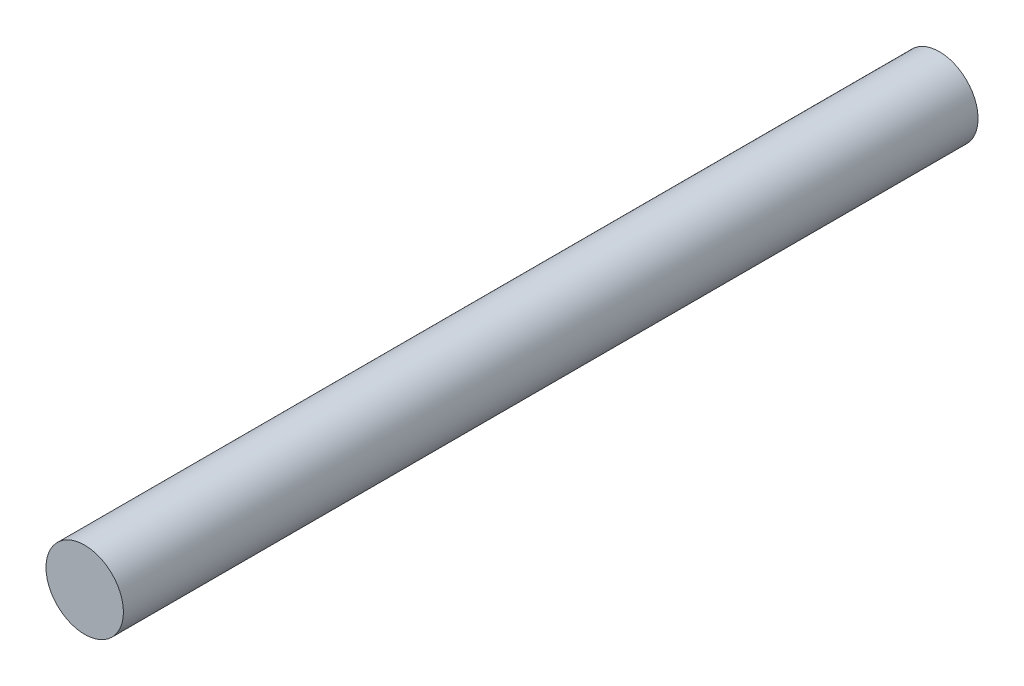
ISO-10303-21;
HEADER;
FILE_DESCRIPTION(('STEP AP214'),'2;1');
FILE_NAME('part.step','',(''),(''),'','','');
FILE_SCHEMA(('AUTOMOTIVE_DESIGN { 1 0 10303 214 1 1 1 1 }'));
ENDSEC;
DATA;
#1=APPLICATION_CONTEXT('core data for automotive mechanical design processes');
#2=APPLICATION_PROTOCOL_DEFINITION('international standard','automotive_design',2000,#1);
#3=PRODUCT_CONTEXT('',#1,'mechanical');
#4=PRODUCT('Part','Part','',(#3));
#5=PRODUCT_RELATED_PRODUCT_CATEGORY('part','',(#4));
#6=PRODUCT_DEFINITION_FORMATION('','',#4);
#7=PRODUCT_DEFINITION_CONTEXT('part definition',#1,'design');
#8=PRODUCT_DEFINITION('design','',#6,#7);
#9=PRODUCT_DEFINITION_SHAPE('','',#8);
#10=(LENGTH_UNIT() NAMED_UNIT(*) SI_UNIT(.MILLI.,.METRE.));
#11=(NAMED_UNIT(*) PLANE_ANGLE_UNIT() SI_UNIT($,.RADIAN.));
#12=(NAMED_UNIT(*) SI_UNIT($,.STERADIAN.) SOLID_ANGLE_UNIT());
#13=UNCERTAINTY_MEASURE_WITH_UNIT(LENGTH_MEASURE(1.E-05),#10,'distance_accuracy_value','');
#14=(GEOMETRIC_REPRESENTATION_CONTEXT(3) GLOBAL_UNCERTAINTY_ASSIGNED_CONTEXT((#13)) GLOBAL_UNIT_ASSIGNED_CONTEXT((#10,
#11,#12)) REPRESENTATION_CONTEXT('',''));
#15=CARTESIAN_POINT('',(0.,0.,0.));
#16=DIRECTION('',(0.,0.,1.));
#17=DIRECTION('',(1.,0.,0.));
#18=AXIS2_PLACEMENT_3D('',#15,#16,#17);
#19=CARTESIAN_POINT('',(0.,0.,116.));
#20=DIRECTION('',(0.,0.,-1.));
#21=DIRECTION('',(-1.,0.,0.));
#22=AXIS2_PLACEMENT_3D('',#19,#20,#21);
#23=CYLINDRICAL_SURFACE('',#22,5.25);
#24=CARTESIAN_POINT('',(0.,0.,116.));
#25=DIRECTION('',(0.,0.,1.));
#26=DIRECTION('',(1.,0.,0.));
#27=AXIS2_PLACEMENT_3D('',#24,#25,#26);
#28=CIRCLE('',#27,5.25);
#29=CARTESIAN_POINT('',(-5.25,0.,116.));
#30=VERTEX_POINT('',#29);
#31=EDGE_CURVE('E10',#30,#30,#28,.T.);
#32=CARTESIAN_POINT('',(0.,0.,0.));
#33=DIRECTION('',(0.,0.,1.));
#34=DIRECTION('',(1.,0.,0.));
#35=AXIS2_PLACEMENT_3D('',#32,#33,#34);
#36=CIRCLE('',#35,5.25);
#37=CARTESIAN_POINT('',(-5.25,0.,0.));
#38=VERTEX_POINT('',#37);
#39=EDGE_CURVE('E31',#38,#38,#36,.T.);
#40=CARTESIAN_POINT('',(-5.25,0.,116.));
#41=CARTESIAN_POINT('',(-5.25,0.,114.791666666667));
#42=CARTESIAN_POINT('',(-5.25,0.,113.583333333333));
#43=CARTESIAN_POINT('',(-5.25,0.,111.166666666667));
#44=CARTESIAN_POINT('',(-5.25,0.,109.958333333333));
#45=CARTESIAN_POINT('',(-5.25,0.,107.541666666667));
#46=CARTESIAN_POINT('',(-5.25,0.,106.333333333333));
#47=CARTESIAN_POINT('',(-5.25,0.,103.916666666667));
#48=CARTESIAN_POINT('',(-5.25,0.,102.708333333333));
#49=CARTESIAN_POINT('',(-5.25,0.,100.291666666667));
#50=CARTESIAN_POINT('',(-5.25,0.,99.0833333333333));
#51=CARTESIAN_POINT('',(-5.25,0.,96.6666666666667));
#52=CARTESIAN_POINT('',(-5.25,0.,95.4583333333333));
#53=CARTESIAN_POINT('',(-5.25,0.,93.0416666666667));
#54=CARTESIAN_POINT('',(-5.25,0.,91.8333333333333));
#55=CARTESIAN_POINT('',(-5.25,0.,89.4166666666667));
#56=CARTESIAN_POINT('',(-5.25,0.,88.2083333333333));
#57=CARTESIAN_POINT('',(-5.25,0.,85.7916666666667));
#58=CARTESIAN_POINT('',(-5.25,0.,84.5833333333333));
#59=CARTESIAN_POINT('',(-5.25,0.,82.1666666666667));
#60=CARTESIAN_POINT('',(-5.25,0.,80.9583333333333));
#61=CARTESIAN_POINT('',(-5.25,0.,78.5416666666667));
#62=CARTESIAN_POINT('',(-5.25,0.,77.3333333333333));
#63=CARTESIAN_POINT('',(-5.25,0.,74.9166666666667));
#64=CARTESIAN_POINT('',(-5.25,0.,73.7083333333333));
#65=CARTESIAN_POINT('',(-5.25,0.,71.2916666666667));
#66=CARTESIAN_POINT('',(-5.25,0.,70.0833333333333));
#67=CARTESIAN_POINT('',(-5.25,0.,67.6666666666667));
#68=CARTESIAN_POINT('',(-5.25,0.,66.4583333333333));
#69=CARTESIAN_POINT('',(-5.25,0.,64.0416666666667));
#70=CARTESIAN_POINT('',(-5.25,0.,62.8333333333333));
#71=CARTESIAN_POINT('',(-5.25,0.,60.4166666666667));
#72=CARTESIAN_POINT('',(-5.25,0.,59.2083333333333));
#73=CARTESIAN_POINT('',(-5.25,0.,56.7916666666667));
#74=CARTESIAN_POINT('',(-5.25,0.,55.5833333333333));
#75=CARTESIAN_POINT('',(-5.25,0.,53.1666666666667));
#76=CARTESIAN_POINT('',(-5.25,0.,51.9583333333333));
#77=CARTESIAN_POINT('',(-5.25,0.,49.5416666666667));
#78=CARTESIAN_POINT('',(-5.25,0.,48.3333333333333));
#79=CARTESIAN_POINT('',(-5.25,0.,45.9166666666667));
#80=CARTESIAN_POINT('',(-5.25,0.,44.7083333333333));
#81=CARTESIAN_POINT('',(-5.25,0.,42.2916666666667));
#82=CARTESIAN_POINT('',(-5.25,0.,41.0833333333333));
#83=CARTESIAN_POINT('',(-5.25,0.,38.6666666666667));
#84=CARTESIAN_POINT('',(-5.25,0.,37.4583333333333));
#85=CARTESIAN_POINT('',(-5.25,0.,35.0416666666667));
#86=CARTESIAN_POINT('',(-5.25,0.,33.8333333333333));
#87=CARTESIAN_POINT('',(-5.25,0.,31.4166666666667));
#88=CARTESIAN_POINT('',(-5.25,0.,30.2083333333333));
#89=CARTESIAN_POINT('',(-5.25,0.,27.7916666666667));
#90=CARTESIAN_POINT('',(-5.25,0.,26.5833333333333));
#91=CARTESIAN_POINT('',(-5.25,0.,24.1666666666667));
#92=CARTESIAN_POINT('',(-5.25,0.,22.9583333333333));
#93=CARTESIAN_POINT('',(-5.25,0.,20.5416666666667));
#94=CARTESIAN_POINT('',(-5.25,0.,19.3333333333333));
#95=CARTESIAN_POINT('',(-5.25,0.,16.9166666666667));
#96=CARTESIAN_POINT('',(-5.25,0.,15.7083333333333));
#97=CARTESIAN_POINT('',(-5.25,0.,13.2916666666667));
#98=CARTESIAN_POINT('',(-5.25,0.,12.0833333333333));
#99=CARTESIAN_POINT('',(-5.25,0.,9.66666666666667));
#100=CARTESIAN_POINT('',(-5.25,0.,8.45833333333334));
#101=CARTESIAN_POINT('',(-5.25,0.,6.04166666666667));
#102=CARTESIAN_POINT('',(-5.25,0.,4.83333333333334));
#103=CARTESIAN_POINT('',(-5.25,0.,2.41666666666667));
#104=CARTESIAN_POINT('',(-5.25,0.,1.20833333333333));
#105=CARTESIAN_POINT('',(-5.25,0.,0.));
#106=B_SPLINE_CURVE_WITH_KNOTS('',3,(#40,#41,#42,#43,#44,#45,#46,#47,#48,#49,#50,#51,#52,#53,
#54,#55,#56,#57,#58,#59,#60,#61,#62,#63,#64,#65,#66,#67,#68,#69,#70,#71,#72,#73,#74,#75,#76,#77,
#78,#79,#80,#81,#82,#83,#84,#85,#86,#87,#88,#89,#90,#91,#92,#93,#94,#95,#96,#97,#98,#99,#100,
#101,#102,#103,#104,#105),.UNSPECIFIED.,.F.,.F.,(4,2,2,2,2,2,2,2,2,2,2,2,2,2,2,2,2,2,2,2,2,2,2,
2,2,2,2,2,2,2,2,2,4),(0.,3.62499999999999,7.24999999999999,10.875,14.5,18.125,21.75,25.375,29.,
32.625,36.25,39.875,43.5,47.125,50.75,54.375,58.,61.625,65.25,68.875,72.5,76.125,79.75,83.375,
87.,90.625,94.25,97.875,101.5,105.125,108.75,112.375,116.),.UNSPECIFIED.);
#107=EDGE_CURVE('BSEAM28',#30,#38,#106,.T.);
#108=ORIENTED_EDGE('',*,*,#31,.F.);
#109=ORIENTED_EDGE('',*,*,#39,.T.);
#110=ORIENTED_EDGE('',*,*,#107,.T.);
#111=ORIENTED_EDGE('',*,*,#107,.F.);
#112=EDGE_LOOP('',(#108,#110,#109,#111));
#113=FACE_BOUND('',#112,.T.);
#114=ADVANCED_FACE('F28',(#113),#23,.T.);
#115=CARTESIAN_POINT('',(0.,0.,116.));
#116=DIRECTION('',(0.,0.,1.));
#117=DIRECTION('',(1.,0.,0.));
#118=AXIS2_PLACEMENT_3D('',#115,#116,#117);
#119=PLANE('',#118);
#120=ORIENTED_EDGE('',*,*,#31,.T.);
#121=EDGE_LOOP('',(#120));
#122=FACE_BOUND('',#121,.T.);
#123=ADVANCED_FACE('F43',(#122),#119,.T.);
#124=CARTESIAN_POINT('',(0.,0.,0.));
#125=DIRECTION('',(0.,0.,1.));
#126=DIRECTION('',(1.,0.,0.));
#127=AXIS2_PLACEMENT_3D('',#124,#125,#126);
#128=PLANE('',#127);
#129=ORIENTED_EDGE('',*,*,#39,.F.);
#130=EDGE_LOOP('',(#129));
#131=FACE_BOUND('',#130,.T.);
#132=ADVANCED_FACE('F41',(#131),#128,.F.);
#133=CLOSED_SHELL('',(#114,#123,#132));
#134=MANIFOLD_SOLID_BREP('B2',#133);
#135=ADVANCED_BREP_SHAPE_REPRESENTATION('',(#18,#134),#14);
#136=SHAPE_DEFINITION_REPRESENTATION(#9,#135);
ENDSEC;
END-ISO-10303-21;
